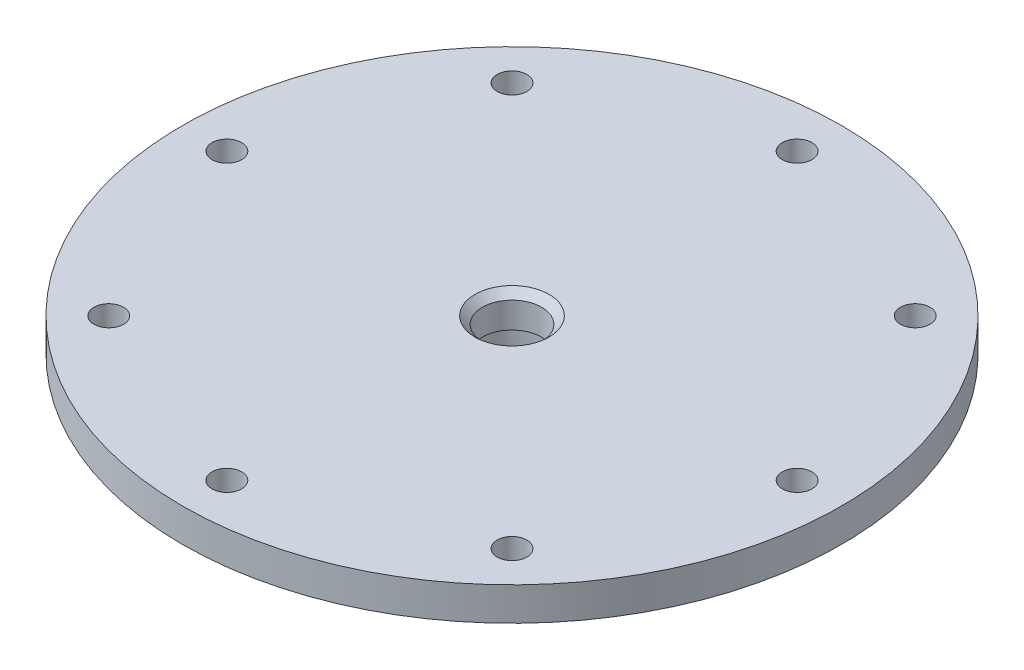
ISO-10303-21;
HEADER;
FILE_DESCRIPTION(('STEP AP214'),'2;1');
FILE_NAME('part.step','',(''),(''),'','','');
FILE_SCHEMA(('AUTOMOTIVE_DESIGN { 1 0 10303 214 1 1 1 1 }'));
ENDSEC;
DATA;
#1=APPLICATION_CONTEXT('core data for automotive mechanical design processes');
#2=APPLICATION_PROTOCOL_DEFINITION('international standard','automotive_design',2000,#1);
#3=PRODUCT_CONTEXT('',#1,'mechanical');
#4=PRODUCT('Part','Part','',(#3));
#5=PRODUCT_RELATED_PRODUCT_CATEGORY('part','',(#4));
#6=PRODUCT_DEFINITION_FORMATION('','',#4);
#7=PRODUCT_DEFINITION_CONTEXT('part definition',#1,'design');
#8=PRODUCT_DEFINITION('design','',#6,#7);
#9=PRODUCT_DEFINITION_SHAPE('','',#8);
#10=(LENGTH_UNIT() NAMED_UNIT(*) SI_UNIT(.MILLI.,.METRE.));
#11=(NAMED_UNIT(*) PLANE_ANGLE_UNIT() SI_UNIT($,.RADIAN.));
#12=(NAMED_UNIT(*) SI_UNIT($,.STERADIAN.) SOLID_ANGLE_UNIT());
#13=UNCERTAINTY_MEASURE_WITH_UNIT(LENGTH_MEASURE(1.E-05),#10,'distance_accuracy_value','');
#14=(GEOMETRIC_REPRESENTATION_CONTEXT(3) GLOBAL_UNCERTAINTY_ASSIGNED_CONTEXT((#13)) GLOBAL_UNIT_ASSIGNED_CONTEXT((#10,
#11,#12)) REPRESENTATION_CONTEXT('',''));
#15=CARTESIAN_POINT('',(0.,0.,0.));
#16=DIRECTION('',(0.,0.,1.));
#17=DIRECTION('',(1.,0.,0.));
#18=AXIS2_PLACEMENT_3D('',#15,#16,#17);
#19=CARTESIAN_POINT('',(0.,0.,0.));
#20=DIRECTION('',(0.,1.,0.));
#21=DIRECTION('',(0.,0.,1.));
#22=AXIS2_PLACEMENT_3D('',#19,#20,#21);
#23=PLANE('',#22);
#24=CARTESIAN_POINT('',(-13.6118055378409,0.,-13.6118055378412));
#25=DIRECTION('',(0.,1.,0.));
#26=DIRECTION('',(0.,0.,1.));
#27=AXIS2_PLACEMENT_3D('',#24,#25,#26);
#28=CIRCLE('',#27,0.999999999999999);
#29=CARTESIAN_POINT('',(-13.6118055378409,0.,-12.6118055378412));
#30=VERTEX_POINT('',#29);
#31=EDGE_CURVE('E106',#30,#30,#28,.T.);
#32=ORIENTED_EDGE('',*,*,#31,.T.);
#33=EDGE_LOOP('',(#32));
#34=FACE_BOUND('',#33,.T.);
#35=CARTESIAN_POINT('',(-19.2499999999997,0.,2.77928312802271E-13));
#36=DIRECTION('',(0.,1.,0.));
#37=DIRECTION('',(0.,0.,1.));
#38=AXIS2_PLACEMENT_3D('',#35,#36,#37);
#39=CIRCLE('',#38,1.00000000000054);
#40=CARTESIAN_POINT('',(-19.2499999999997,0.,1.00000000000082));
#41=VERTEX_POINT('',#40);
#42=EDGE_CURVE('E100',#41,#41,#39,.T.);
#43=ORIENTED_EDGE('',*,*,#42,.T.);
#44=EDGE_LOOP('',(#43));
#45=FACE_BOUND('',#44,.T.);
#46=CARTESIAN_POINT('',(-13.6118055378406,0.,13.6118055378412));
#47=DIRECTION('',(0.,1.,0.));
#48=DIRECTION('',(0.,0.,1.));
#49=AXIS2_PLACEMENT_3D('',#46,#47,#48);
#50=CIRCLE('',#49,1.00000000000067);
#51=CARTESIAN_POINT('',(-13.6118055378406,0.,14.6118055378419));
#52=VERTEX_POINT('',#51);
#53=EDGE_CURVE('E94',#52,#52,#50,.T.);
#54=ORIENTED_EDGE('',*,*,#53,.T.);
#55=EDGE_LOOP('',(#54));
#56=FACE_BOUND('',#55,.T.);
#57=CARTESIAN_POINT('',(5.45897708233667E-13,0.,19.25));
#58=DIRECTION('',(0.,1.,0.));
#59=DIRECTION('',(0.,0.,1.));
#60=AXIS2_PLACEMENT_3D('',#57,#58,#59);
#61=CIRCLE('',#60,1.00000000000065);
#62=CARTESIAN_POINT('',(5.45897708233667E-13,0.,20.2500000000007));
#63=VERTEX_POINT('',#62);
#64=EDGE_CURVE('E88',#63,#63,#61,.T.);
#65=ORIENTED_EDGE('',*,*,#64,.T.);
#66=EDGE_LOOP('',(#65));
#67=FACE_BOUND('',#66,.T.);
#68=CARTESIAN_POINT('',(13.6118055378415,0.,13.6118055378408));
#69=DIRECTION('',(0.,1.,0.));
#70=DIRECTION('',(0.,0.,1.));
#71=AXIS2_PLACEMENT_3D('',#68,#69,#70);
#72=CIRCLE('',#71,1.00000000000049);
#73=CARTESIAN_POINT('',(13.6118055378415,0.,14.6118055378413));
#74=VERTEX_POINT('',#73);
#75=EDGE_CURVE('E82',#74,#74,#72,.T.);
#76=ORIENTED_EDGE('',*,*,#75,.T.);
#77=EDGE_LOOP('',(#76));
#78=FACE_BOUND('',#77,.T.);
#79=CARTESIAN_POINT('',(19.25,0.,0.));
#80=DIRECTION('',(0.,1.,0.));
#81=DIRECTION('',(0.,0.,1.));
#82=AXIS2_PLACEMENT_3D('',#79,#80,#81);
#83=CIRCLE('',#82,1.);
#84=CARTESIAN_POINT('',(19.25,0.,1.00000000000007));
#85=VERTEX_POINT('',#84);
#86=EDGE_CURVE('E76',#85,#85,#83,.T.);
#87=ORIENTED_EDGE('',*,*,#86,.T.);
#88=EDGE_LOOP('',(#87));
#89=FACE_BOUND('',#88,.T.);
#90=CARTESIAN_POINT('',(13.6118055378411,0.,-13.611805537841));
#91=DIRECTION('',(0.,1.,0.));
#92=DIRECTION('',(0.,0.,1.));
#93=AXIS2_PLACEMENT_3D('',#90,#91,#92);
#94=CIRCLE('',#93,1.);
#95=CARTESIAN_POINT('',(13.6118055378411,0.,-12.611805537841));
#96=VERTEX_POINT('',#95);
#97=EDGE_CURVE('E70',#96,#96,#94,.T.);
#98=ORIENTED_EDGE('',*,*,#97,.T.);
#99=EDGE_LOOP('',(#98));
#100=FACE_BOUND('',#99,.T.);
#101=CARTESIAN_POINT('',(0.,0.,-19.25));
#102=DIRECTION('',(0.,1.,0.));
#103=DIRECTION('',(0.,0.,1.));
#104=AXIS2_PLACEMENT_3D('',#101,#102,#103);
#105=CIRCLE('',#104,1.);
#106=CARTESIAN_POINT('',(0.,0.,-18.25));
#107=VERTEX_POINT('',#106);
#108=EDGE_CURVE('E62',#107,#107,#105,.T.);
#109=ORIENTED_EDGE('',*,*,#108,.T.);
#110=EDGE_LOOP('',(#109));
#111=FACE_BOUND('',#110,.T.);
#112=CARTESIAN_POINT('',(0.,0.,0.));
#113=DIRECTION('',(0.,1.,0.));
#114=DIRECTION('',(0.,0.,1.));
#115=AXIS2_PLACEMENT_3D('',#112,#113,#114);
#116=CIRCLE('',#115,22.25);
#117=CARTESIAN_POINT('',(0.,0.,22.25));
#118=VERTEX_POINT('',#117);
#119=EDGE_CURVE('E47',#118,#118,#116,.T.);
#120=ORIENTED_EDGE('',*,*,#119,.F.);
#121=EDGE_LOOP('',(#120));
#122=FACE_BOUND('',#121,.T.);
#123=CARTESIAN_POINT('',(0.,0.,0.));
#124=DIRECTION('',(0.,1.,0.));
#125=DIRECTION('',(0.,0.,1.));
#126=AXIS2_PLACEMENT_3D('',#123,#124,#125);
#127=CIRCLE('',#126,3.65);
#128=CARTESIAN_POINT('',(0.,0.,3.65));
#129=VERTEX_POINT('',#128);
#130=EDGE_CURVE('E40',#129,#129,#127,.F.);
#131=ORIENTED_EDGE('',*,*,#130,.F.);
#132=EDGE_LOOP('',(#131));
#133=FACE_BOUND('',#132,.T.);
#134=ADVANCED_FACE('F29',(#34,#45,#56,#67,#78,#89,#100,#111,#122,#133),#23,.F.);
#135=CARTESIAN_POINT('',(0.,2.25,0.));
#136=DIRECTION('',(0.,1.,0.));
#137=DIRECTION('',(0.,0.,1.));
#138=AXIS2_PLACEMENT_3D('',#135,#136,#137);
#139=PLANE('',#138);
#140=CARTESIAN_POINT('',(-13.6118055378409,2.25,-13.6118055378412));
#141=DIRECTION('',(0.,1.,0.));
#142=DIRECTION('',(0.,0.,1.));
#143=AXIS2_PLACEMENT_3D('',#140,#141,#142);
#144=CIRCLE('',#143,0.999999999999999);
#145=CARTESIAN_POINT('',(-13.6118055378409,2.25,-12.6118055378412));
#146=VERTEX_POINT('',#145);
#147=EDGE_CURVE('E109',#146,#146,#144,.T.);
#148=ORIENTED_EDGE('',*,*,#147,.F.);
#149=EDGE_LOOP('',(#148));
#150=FACE_BOUND('',#149,.T.);
#151=CARTESIAN_POINT('',(-19.2499999999997,2.25,2.77928312802271E-13));
#152=DIRECTION('',(0.,1.,0.));
#153=DIRECTION('',(0.,0.,1.));
#154=AXIS2_PLACEMENT_3D('',#151,#152,#153);
#155=CIRCLE('',#154,1.00000000000054);
#156=CARTESIAN_POINT('',(-19.2499999999997,2.25,1.00000000000082));
#157=VERTEX_POINT('',#156);
#158=EDGE_CURVE('E103',#157,#157,#155,.T.);
#159=ORIENTED_EDGE('',*,*,#158,.F.);
#160=EDGE_LOOP('',(#159));
#161=FACE_BOUND('',#160,.T.);
#162=CARTESIAN_POINT('',(-13.6118055378406,2.25,13.6118055378412));
#163=DIRECTION('',(0.,1.,0.));
#164=DIRECTION('',(0.,0.,1.));
#165=AXIS2_PLACEMENT_3D('',#162,#163,#164);
#166=CIRCLE('',#165,1.00000000000067);
#167=CARTESIAN_POINT('',(-13.6118055378406,2.25,14.6118055378419));
#168=VERTEX_POINT('',#167);
#169=EDGE_CURVE('E97',#168,#168,#166,.T.);
#170=ORIENTED_EDGE('',*,*,#169,.F.);
#171=EDGE_LOOP('',(#170));
#172=FACE_BOUND('',#171,.T.);
#173=CARTESIAN_POINT('',(5.45897708233667E-13,2.25,19.25));
#174=DIRECTION('',(0.,1.,0.));
#175=DIRECTION('',(0.,0.,1.));
#176=AXIS2_PLACEMENT_3D('',#173,#174,#175);
#177=CIRCLE('',#176,1.00000000000065);
#178=CARTESIAN_POINT('',(5.45897708233667E-13,2.25,20.2500000000007));
#179=VERTEX_POINT('',#178);
#180=EDGE_CURVE('E91',#179,#179,#177,.T.);
#181=ORIENTED_EDGE('',*,*,#180,.F.);
#182=EDGE_LOOP('',(#181));
#183=FACE_BOUND('',#182,.T.);
#184=CARTESIAN_POINT('',(13.6118055378415,2.25,13.6118055378408));
#185=DIRECTION('',(0.,1.,0.));
#186=DIRECTION('',(0.,0.,1.));
#187=AXIS2_PLACEMENT_3D('',#184,#185,#186);
#188=CIRCLE('',#187,1.00000000000049);
#189=CARTESIAN_POINT('',(13.6118055378415,2.25,14.6118055378413));
#190=VERTEX_POINT('',#189);
#191=EDGE_CURVE('E85',#190,#190,#188,.T.);
#192=ORIENTED_EDGE('',*,*,#191,.F.);
#193=EDGE_LOOP('',(#192));
#194=FACE_BOUND('',#193,.T.);
#195=CARTESIAN_POINT('',(19.25,2.25,0.));
#196=DIRECTION('',(0.,1.,0.));
#197=DIRECTION('',(0.,0.,1.));
#198=AXIS2_PLACEMENT_3D('',#195,#196,#197);
#199=CIRCLE('',#198,1.);
#200=CARTESIAN_POINT('',(19.25,2.25,1.00000000000007));
#201=VERTEX_POINT('',#200);
#202=EDGE_CURVE('E79',#201,#201,#199,.T.);
#203=ORIENTED_EDGE('',*,*,#202,.F.);
#204=EDGE_LOOP('',(#203));
#205=FACE_BOUND('',#204,.T.);
#206=CARTESIAN_POINT('',(13.6118055378411,2.25,-13.611805537841));
#207=DIRECTION('',(0.,1.,0.));
#208=DIRECTION('',(0.,0.,1.));
#209=AXIS2_PLACEMENT_3D('',#206,#207,#208);
#210=CIRCLE('',#209,1.);
#211=CARTESIAN_POINT('',(13.6118055378411,2.25,-12.611805537841));
#212=VERTEX_POINT('',#211);
#213=EDGE_CURVE('E73',#212,#212,#210,.T.);
#214=ORIENTED_EDGE('',*,*,#213,.F.);
#215=EDGE_LOOP('',(#214));
#216=FACE_BOUND('',#215,.T.);
#217=CARTESIAN_POINT('',(0.,2.25,-19.25));
#218=DIRECTION('',(0.,1.,0.));
#219=DIRECTION('',(0.,0.,1.));
#220=AXIS2_PLACEMENT_3D('',#217,#218,#219);
#221=CIRCLE('',#220,1.);
#222=CARTESIAN_POINT('',(0.,2.25,-18.25));
#223=VERTEX_POINT('',#222);
#224=EDGE_CURVE('E67',#223,#223,#221,.T.);
#225=ORIENTED_EDGE('',*,*,#224,.F.);
#226=EDGE_LOOP('',(#225));
#227=FACE_BOUND('',#226,.T.);
#228=CARTESIAN_POINT('',(0.,2.25,0.));
#229=DIRECTION('',(0.,1.,0.));
#230=DIRECTION('',(0.,0.,1.));
#231=AXIS2_PLACEMENT_3D('',#228,#229,#230);
#232=CIRCLE('',#231,2.50000000000002);
#233=CARTESIAN_POINT('',(0.,2.25,2.50000000000002));
#234=VERTEX_POINT('',#233);
#235=EDGE_CURVE('E10',#234,#234,#232,.F.);
#236=ORIENTED_EDGE('',*,*,#235,.T.);
#237=EDGE_LOOP('',(#236));
#238=FACE_BOUND('',#237,.T.);
#239=CARTESIAN_POINT('',(0.,2.25,0.));
#240=DIRECTION('',(0.,1.,0.));
#241=DIRECTION('',(0.,0.,1.));
#242=AXIS2_PLACEMENT_3D('',#239,#240,#241);
#243=CIRCLE('',#242,22.25);
#244=CARTESIAN_POINT('',(0.,2.25,22.25));
#245=VERTEX_POINT('',#244);
#246=EDGE_CURVE('E44',#245,#245,#243,.T.);
#247=ORIENTED_EDGE('',*,*,#246,.T.);
#248=EDGE_LOOP('',(#247));
#249=FACE_BOUND('',#248,.T.);
#250=ADVANCED_FACE('F116',(#150,#161,#172,#183,#194,#205,#216,#227,#238,#249),#139,.T.);
#251=CARTESIAN_POINT('',(0.,0.,0.));
#252=DIRECTION('',(0.,-1.,0.));
#253=DIRECTION('',(0.,0.,-1.));
#254=AXIS2_PLACEMENT_3D('',#251,#252,#253);
#255=CIRCLE('',#254,2.5);
#256=CARTESIAN_POINT('',(0.,0.,-2.5));
#257=VERTEX_POINT('',#256);
#258=EDGE_CURVE('E59',#257,#257,#255,.T.);
#259=ORIENTED_EDGE('',*,*,#258,.T.);
#260=EDGE_LOOP('',(#259));
#261=FACE_BOUND('',#260,.T.);
#262=CARTESIAN_POINT('',(0.,0.,0.));
#263=DIRECTION('',(0.,1.,0.));
#264=DIRECTION('',(0.,0.,1.));
#265=AXIS2_PLACEMENT_3D('',#262,#263,#264);
#266=CIRCLE('',#265,2.);
#267=CARTESIAN_POINT('',(0.,0.,2.));
#268=VERTEX_POINT('',#267);
#269=EDGE_CURVE('E50',#268,#268,#266,.T.);
#270=ORIENTED_EDGE('',*,*,#269,.T.);
#271=EDGE_LOOP('',(#270));
#272=FACE_BOUND('',#271,.T.);
#273=ADVANCED_FACE('F119',(#261,#272),#23,.F.);
#274=CARTESIAN_POINT('',(0.,2.25,0.));
#275=DIRECTION('',(0.,-1.,0.));
#276=DIRECTION('',(0.,0.,-1.));
#277=AXIS2_PLACEMENT_3D('',#274,#275,#276);
#278=CYLINDRICAL_SURFACE('',#277,22.25);
#279=ORIENTED_EDGE('',*,*,#246,.F.);
#280=EDGE_LOOP('',(#279));
#281=FACE_BOUND('',#280,.T.);
#282=ORIENTED_EDGE('',*,*,#119,.T.);
#283=EDGE_LOOP('',(#282));
#284=FACE_BOUND('',#283,.T.);
#285=ADVANCED_FACE('F137',(#281,#284),#278,.T.);
#286=CARTESIAN_POINT('',(0.,2.25,0.));
#287=DIRECTION('',(0.,-1.,0.));
#288=DIRECTION('',(0.,0.,-1.));
#289=AXIS2_PLACEMENT_3D('',#286,#287,#288);
#290=CYLINDRICAL_SURFACE('',#289,2.);
#291=CARTESIAN_POINT('',(0.,1.74999999999998,0.));
#292=DIRECTION('',(0.,1.,0.));
#293=DIRECTION('',(0.,0.,1.));
#294=AXIS2_PLACEMENT_3D('',#291,#292,#293);
#295=CIRCLE('',#294,2.);
#296=CARTESIAN_POINT('',(0.,1.74999999999998,2.));
#297=VERTEX_POINT('',#296);
#298=EDGE_CURVE('E36',#297,#297,#295,.T.);
#299=ORIENTED_EDGE('',*,*,#298,.T.);
#300=EDGE_LOOP('',(#299));
#301=FACE_BOUND('',#300,.T.);
#302=ORIENTED_EDGE('',*,*,#269,.F.);
#303=EDGE_LOOP('',(#302));
#304=FACE_BOUND('',#303,.T.);
#305=ADVANCED_FACE('F140',(#301,#304),#290,.F.);
#306=CARTESIAN_POINT('',(0.,-3.,0.));
#307=DIRECTION('',(0.,-1.,0.));
#308=DIRECTION('',(0.,0.,-1.));
#309=AXIS2_PLACEMENT_3D('',#306,#307,#308);
#310=PLANE('',#309);
#311=CARTESIAN_POINT('',(0.,-3.,0.));
#312=DIRECTION('',(0.,-1.,0.));
#313=DIRECTION('',(0.,0.,-1.));
#314=AXIS2_PLACEMENT_3D('',#311,#312,#313);
#315=CIRCLE('',#314,3.65);
#316=CARTESIAN_POINT('',(0.,-3.,-3.65));
#317=VERTEX_POINT('',#316);
#318=EDGE_CURVE('E55',#317,#317,#315,.T.);
#319=ORIENTED_EDGE('',*,*,#318,.T.);
#320=EDGE_LOOP('',(#319));
#321=FACE_BOUND('',#320,.T.);
#322=CARTESIAN_POINT('',(0.,-3.,0.));
#323=DIRECTION('',(0.,-1.,0.));
#324=DIRECTION('',(0.,0.,-1.));
#325=AXIS2_PLACEMENT_3D('',#322,#323,#324);
#326=CIRCLE('',#325,2.5);
#327=CARTESIAN_POINT('',(0.,-3.,-2.5));
#328=VERTEX_POINT('',#327);
#329=EDGE_CURVE('E58',#328,#328,#326,.T.);
#330=ORIENTED_EDGE('',*,*,#329,.F.);
#331=EDGE_LOOP('',(#330));
#332=FACE_BOUND('',#331,.T.);
#333=ADVANCED_FACE('F152',(#321,#332),#310,.T.);
#334=CARTESIAN_POINT('',(0.,-3.,0.));
#335=DIRECTION('',(0.,1.,0.));
#336=DIRECTION('',(0.,0.,1.));
#337=AXIS2_PLACEMENT_3D('',#334,#335,#336);
#338=CYLINDRICAL_SURFACE('',#337,3.65);
#339=ORIENTED_EDGE('',*,*,#318,.F.);
#340=EDGE_LOOP('',(#339));
#341=FACE_BOUND('',#340,.T.);
#342=ORIENTED_EDGE('',*,*,#130,.T.);
#343=EDGE_LOOP('',(#342));
#344=FACE_BOUND('',#343,.T.);
#345=ADVANCED_FACE('F149',(#341,#344),#338,.T.);
#346=CARTESIAN_POINT('',(0.,-3.,0.));
#347=DIRECTION('',(0.,1.,0.));
#348=DIRECTION('',(0.,0.,1.));
#349=AXIS2_PLACEMENT_3D('',#346,#347,#348);
#350=CYLINDRICAL_SURFACE('',#349,2.5);
#351=ORIENTED_EDGE('',*,*,#329,.T.);
#352=EDGE_LOOP('',(#351));
#353=FACE_BOUND('',#352,.T.);
#354=ORIENTED_EDGE('',*,*,#258,.F.);
#355=EDGE_LOOP('',(#354));
#356=FACE_BOUND('',#355,.T.);
#357=ADVANCED_FACE('F151',(#353,#356),#350,.F.);
#358=CARTESIAN_POINT('',(0.,1.74999999999998,0.));
#359=DIRECTION('',(0.,1.,0.));
#360=DIRECTION('',(0.,0.,1.));
#361=AXIS2_PLACEMENT_3D('',#358,#359,#360);
#362=CONICAL_SURFACE('',#361,2.,0.785398163397449);
#363=ORIENTED_EDGE('',*,*,#235,.F.);
#364=EDGE_LOOP('',(#363));
#365=FACE_BOUND('',#364,.T.);
#366=ORIENTED_EDGE('',*,*,#298,.F.);
#367=EDGE_LOOP('',(#366));
#368=FACE_BOUND('',#367,.T.);
#369=ADVANCED_FACE('F31',(#365,#368),#362,.F.);
#370=CARTESIAN_POINT('',(0.,-3.,-19.25));
#371=DIRECTION('',(0.,1.,0.));
#372=DIRECTION('',(0.,0.,1.));
#373=AXIS2_PLACEMENT_3D('',#370,#371,#372);
#374=CYLINDRICAL_SURFACE('',#373,1.);
#375=ORIENTED_EDGE('',*,*,#224,.T.);
#376=EDGE_LOOP('',(#375));
#377=FACE_BOUND('',#376,.T.);
#378=ORIENTED_EDGE('',*,*,#108,.F.);
#379=EDGE_LOOP('',(#378));
#380=FACE_BOUND('',#379,.T.);
#381=ADVANCED_FACE('F209',(#377,#380),#374,.F.);
#382=CARTESIAN_POINT('',(13.6118055378411,-3.,-13.611805537841));
#383=DIRECTION('',(0.,1.,0.));
#384=DIRECTION('',(0.,0.,1.));
#385=AXIS2_PLACEMENT_3D('',#382,#383,#384);
#386=CYLINDRICAL_SURFACE('',#385,1.);
#387=ORIENTED_EDGE('',*,*,#213,.T.);
#388=EDGE_LOOP('',(#387));
#389=FACE_BOUND('',#388,.T.);
#390=ORIENTED_EDGE('',*,*,#97,.F.);
#391=EDGE_LOOP('',(#390));
#392=FACE_BOUND('',#391,.T.);
#393=ADVANCED_FACE('F216',(#389,#392),#386,.F.);
#394=CARTESIAN_POINT('',(19.25,-3.,0.));
#395=DIRECTION('',(0.,1.,0.));
#396=DIRECTION('',(0.,0.,1.));
#397=AXIS2_PLACEMENT_3D('',#394,#395,#396);
#398=CYLINDRICAL_SURFACE('',#397,1.);
#399=ORIENTED_EDGE('',*,*,#202,.T.);
#400=EDGE_LOOP('',(#399));
#401=FACE_BOUND('',#400,.T.);
#402=ORIENTED_EDGE('',*,*,#86,.F.);
#403=EDGE_LOOP('',(#402));
#404=FACE_BOUND('',#403,.T.);
#405=ADVANCED_FACE('F224',(#401,#404),#398,.F.);
#406=CARTESIAN_POINT('',(13.6118055378415,-3.,13.6118055378408));
#407=DIRECTION('',(0.,1.,0.));
#408=DIRECTION('',(0.,0.,1.));
#409=AXIS2_PLACEMENT_3D('',#406,#407,#408);
#410=CYLINDRICAL_SURFACE('',#409,1.00000000000049);
#411=ORIENTED_EDGE('',*,*,#191,.T.);
#412=EDGE_LOOP('',(#411));
#413=FACE_BOUND('',#412,.T.);
#414=ORIENTED_EDGE('',*,*,#75,.F.);
#415=EDGE_LOOP('',(#414));
#416=FACE_BOUND('',#415,.T.);
#417=ADVANCED_FACE('F232',(#413,#416),#410,.F.);
#418=CARTESIAN_POINT('',(5.45897708233667E-13,-3.,19.25));
#419=DIRECTION('',(0.,1.,0.));
#420=DIRECTION('',(0.,0.,1.));
#421=AXIS2_PLACEMENT_3D('',#418,#419,#420);
#422=CYLINDRICAL_SURFACE('',#421,1.00000000000065);
#423=ORIENTED_EDGE('',*,*,#180,.T.);
#424=EDGE_LOOP('',(#423));
#425=FACE_BOUND('',#424,.T.);
#426=ORIENTED_EDGE('',*,*,#64,.F.);
#427=EDGE_LOOP('',(#426));
#428=FACE_BOUND('',#427,.T.);
#429=ADVANCED_FACE('F240',(#425,#428),#422,.F.);
#430=CARTESIAN_POINT('',(-13.6118055378406,-3.,13.6118055378412));
#431=DIRECTION('',(0.,1.,0.));
#432=DIRECTION('',(0.,0.,1.));
#433=AXIS2_PLACEMENT_3D('',#430,#431,#432);
#434=CYLINDRICAL_SURFACE('',#433,1.00000000000067);
#435=ORIENTED_EDGE('',*,*,#169,.T.);
#436=EDGE_LOOP('',(#435));
#437=FACE_BOUND('',#436,.T.);
#438=ORIENTED_EDGE('',*,*,#53,.F.);
#439=EDGE_LOOP('',(#438));
#440=FACE_BOUND('',#439,.T.);
#441=ADVANCED_FACE('F248',(#437,#440),#434,.F.);
#442=CARTESIAN_POINT('',(-19.2499999999997,-3.,2.77928312802271E-13));
#443=DIRECTION('',(0.,1.,0.));
#444=DIRECTION('',(0.,0.,1.));
#445=AXIS2_PLACEMENT_3D('',#442,#443,#444);
#446=CYLINDRICAL_SURFACE('',#445,1.00000000000054);
#447=ORIENTED_EDGE('',*,*,#158,.T.);
#448=EDGE_LOOP('',(#447));
#449=FACE_BOUND('',#448,.T.);
#450=ORIENTED_EDGE('',*,*,#42,.F.);
#451=EDGE_LOOP('',(#450));
#452=FACE_BOUND('',#451,.T.);
#453=ADVANCED_FACE('F256',(#449,#452),#446,.F.);
#454=CARTESIAN_POINT('',(-13.6118055378409,-3.,-13.6118055378412));
#455=DIRECTION('',(0.,1.,0.));
#456=DIRECTION('',(0.,0.,1.));
#457=AXIS2_PLACEMENT_3D('',#454,#455,#456);
#458=CYLINDRICAL_SURFACE('',#457,0.999999999999999);
#459=ORIENTED_EDGE('',*,*,#147,.T.);
#460=EDGE_LOOP('',(#459));
#461=FACE_BOUND('',#460,.T.);
#462=ORIENTED_EDGE('',*,*,#31,.F.);
#463=EDGE_LOOP('',(#462));
#464=FACE_BOUND('',#463,.T.);
#465=ADVANCED_FACE('F113',(#461,#464),#458,.F.);
#466=CLOSED_SHELL('',(#134,#250,#273,#285,#305,#333,#345,#357,#369,#381,#393,#405,#417,#429,
#441,#453,#465));
#467=MANIFOLD_SOLID_BREP('B2',#466);
#468=ADVANCED_BREP_SHAPE_REPRESENTATION('',(#18,#467),#14);
#469=SHAPE_DEFINITION_REPRESENTATION(#9,#468);
ENDSEC;
END-ISO-10303-21;
